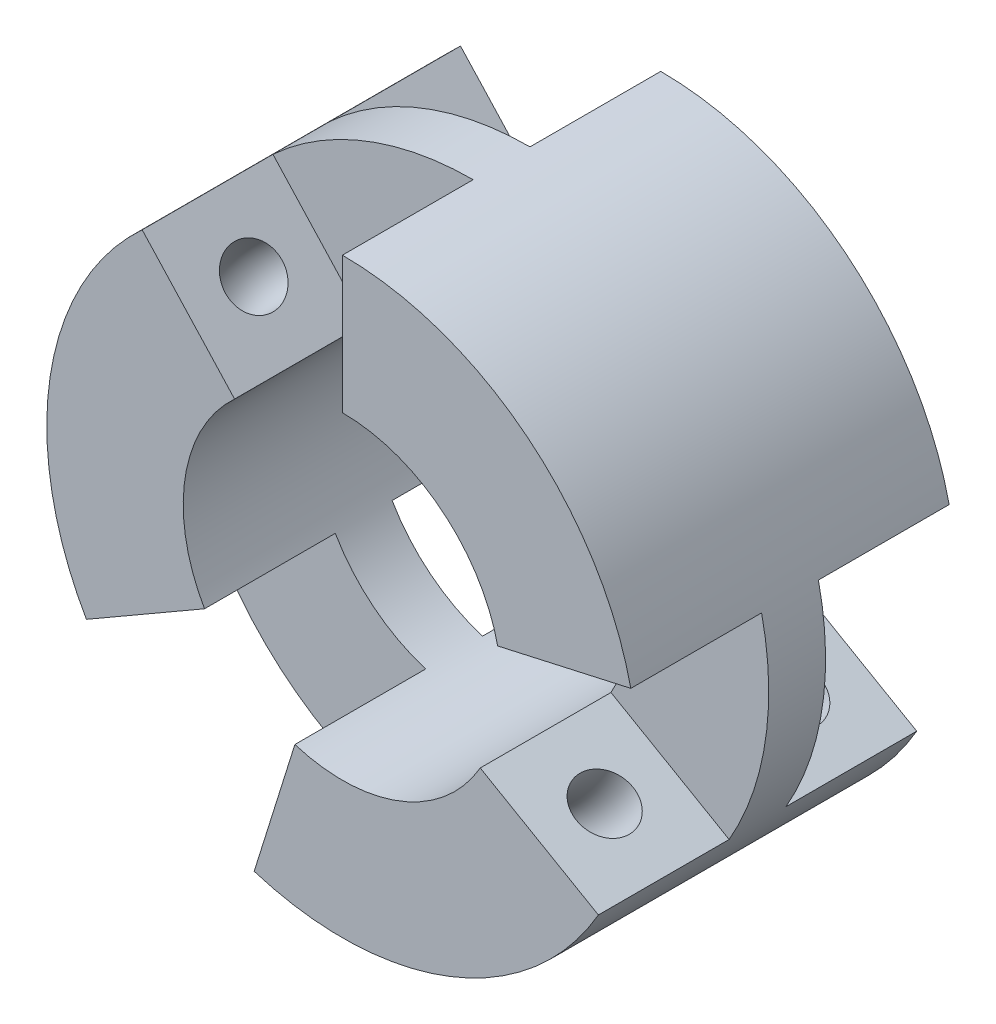
ISO-10303-21;
HEADER;
FILE_DESCRIPTION(('STEP AP214'),'2;1');
FILE_NAME('part.step','',(''),(''),'','','');
FILE_SCHEMA(('AUTOMOTIVE_DESIGN { 1 0 10303 214 1 1 1 1 }'));
ENDSEC;
DATA;
#1=APPLICATION_CONTEXT('core data for automotive mechanical design processes');
#2=APPLICATION_PROTOCOL_DEFINITION('international standard','automotive_design',2000,#1);
#3=PRODUCT_CONTEXT('',#1,'mechanical');
#4=PRODUCT('Part','Part','',(#3));
#5=PRODUCT_RELATED_PRODUCT_CATEGORY('part','',(#4));
#6=PRODUCT_DEFINITION_FORMATION('','',#4);
#7=PRODUCT_DEFINITION_CONTEXT('part definition',#1,'design');
#8=PRODUCT_DEFINITION('design','',#6,#7);
#9=PRODUCT_DEFINITION_SHAPE('','',#8);
#10=(LENGTH_UNIT() NAMED_UNIT(*) SI_UNIT(.MILLI.,.METRE.));
#11=(NAMED_UNIT(*) PLANE_ANGLE_UNIT() SI_UNIT($,.RADIAN.));
#12=(NAMED_UNIT(*) SI_UNIT($,.STERADIAN.) SOLID_ANGLE_UNIT());
#13=UNCERTAINTY_MEASURE_WITH_UNIT(LENGTH_MEASURE(1.E-05),#10,'distance_accuracy_value','');
#14=(GEOMETRIC_REPRESENTATION_CONTEXT(3) GLOBAL_UNCERTAINTY_ASSIGNED_CONTEXT((#13)) GLOBAL_UNIT_ASSIGNED_CONTEXT((#10,
#11,#12)) REPRESENTATION_CONTEXT('',''));
#15=CARTESIAN_POINT('',(0.,0.,0.));
#16=DIRECTION('',(0.,0.,1.));
#17=DIRECTION('',(1.,0.,0.));
#18=AXIS2_PLACEMENT_3D('',#15,#16,#17);
#19=CARTESIAN_POINT('',(0.,0.,0.25));
#20=DIRECTION('',(0.,0.,1.));
#21=DIRECTION('',(1.,0.,0.));
#22=AXIS2_PLACEMENT_3D('',#19,#20,#21);
#23=PLANE('',#22);
#24=DIRECTION('',(-0.677333525702714,0.735676080186879,0.));
#25=VECTOR('',#24,1.);
#26=CARTESIAN_POINT('',(0.,0.,0.25));
#27=LINE('',#26,#25);
#28=CARTESIAN_POINT('',(-0.9482669359838,1.02994651226163,0.25));
#29=VERTEX_POINT('',#28);
#30=CARTESIAN_POINT('',(-1.76106716682706,1.91275780848588,0.25));
#31=VERTEX_POINT('',#30);
#32=EDGE_CURVE('E271',#29,#31,#27,.T.);
#33=ORIENTED_EDGE('',*,*,#32,.F.);
#34=CARTESIAN_POINT('',(0.,0.,0.25));
#35=DIRECTION('',(0.,0.,1.));
#36=DIRECTION('',(1.,0.,0.));
#37=AXIS2_PLACEMENT_3D('',#34,#35,#36);
#38=CIRCLE('',#37,1.4);
#39=CARTESIAN_POINT('',(0.,1.4,0.25));
#40=VERTEX_POINT('',#39);
#41=EDGE_CURVE('E298',#40,#29,#38,.T.);
#42=ORIENTED_EDGE('',*,*,#41,.F.);
#43=DIRECTION('',(0.,1.,0.));
#44=VECTOR('',#43,1.);
#45=CARTESIAN_POINT('',(0.,1.4,0.25));
#46=LINE('',#45,#44);
#47=CARTESIAN_POINT('',(0.,2.6,0.25));
#48=VERTEX_POINT('',#47);
#49=EDGE_CURVE('E332',#40,#48,#46,.T.);
#50=ORIENTED_EDGE('',*,*,#49,.T.);
#51=CARTESIAN_POINT('',(0.,0.,0.25));
#52=DIRECTION('',(0.,0.,1.));
#53=DIRECTION('',(1.,0.,0.));
#54=AXIS2_PLACEMENT_3D('',#51,#52,#53);
#55=CIRCLE('',#54,2.6);
#56=EDGE_CURVE('E303',#48,#31,#55,.T.);
#57=ORIENTED_EDGE('',*,*,#56,.T.);
#58=EDGE_LOOP('',(#33,#42,#50,#57));
#59=FACE_BOUND('',#58,.T.);
#60=ADVANCED_FACE('F33',(#59),#23,.T.);
#61=DIRECTION('',(0.866025403784443,0.499999999999992,0.));
#62=VECTOR('',#61,1.);
#63=CARTESIAN_POINT('',(0.,0.,0.25));
#64=LINE('',#63,#62);
#65=CARTESIAN_POINT('',(-2.25166604983955,-1.29999999999998,0.25));
#66=VERTEX_POINT('',#65);
#67=CARTESIAN_POINT('',(-1.21243556529822,-0.699999999999988,0.25));
#68=VERTEX_POINT('',#67);
#69=EDGE_CURVE('E268',#66,#68,#64,.T.);
#70=ORIENTED_EDGE('',*,*,#69,.F.);
#71=CARTESIAN_POINT('',(-0.775963270022288,-2.48150780848586,0.25));
#72=VERTEX_POINT('',#71);
#73=EDGE_CURVE('E306',#66,#72,#55,.T.);
#74=ORIENTED_EDGE('',*,*,#73,.T.);
#75=DIRECTION('',(-0.298447411547034,-0.954426080186871,0.));
#76=VECTOR('',#75,1.);
#77=CARTESIAN_POINT('',(0.,0.,0.25));
#78=LINE('',#77,#76);
#79=CARTESIAN_POINT('',(-0.417826376165848,-1.33619651226162,0.25));
#80=VERTEX_POINT('',#79);
#81=EDGE_CURVE('E42',#80,#72,#78,.T.);
#82=ORIENTED_EDGE('',*,*,#81,.F.);
#83=EDGE_CURVE('E302',#68,#80,#38,.T.);
#84=ORIENTED_EDGE('',*,*,#83,.F.);
#85=EDGE_LOOP('',(#70,#74,#82,#84));
#86=FACE_BOUND('',#85,.T.);
#87=ADVANCED_FACE('F364',(#86),#23,.T.);
#88=CARTESIAN_POINT('',(0.,0.,1.4));
#89=DIRECTION('',(0.,0.,-1.));
#90=DIRECTION('',(-1.,0.,0.));
#91=AXIS2_PLACEMENT_3D('',#88,#89,#90);
#92=CYLINDRICAL_SURFACE('',#91,1.4);
#93=DIRECTION('',(0.,0.,1.));
#94=VECTOR('',#93,1.);
#95=CARTESIAN_POINT('',(-0.9482669359838,1.02994651226163,-1.4));
#96=LINE('',#95,#94);
#97=CARTESIAN_POINT('',(-0.9482669359838,1.02994651226163,-1.4));
#98=VERTEX_POINT('',#97);
#99=CARTESIAN_POINT('',(-0.9482669359838,1.02994651226163,-0.25));
#100=VERTEX_POINT('',#99);
#101=EDGE_CURVE('E214',#98,#100,#96,.T.);
#102=ORIENTED_EDGE('',*,*,#101,.T.);
#103=CARTESIAN_POINT('',(0.,0.,-0.25));
#104=DIRECTION('',(0.,0.,1.));
#105=DIRECTION('',(1.,0.,0.));
#106=AXIS2_PLACEMENT_3D('',#103,#104,#105);
#107=CIRCLE('',#106,1.4);
#108=CARTESIAN_POINT('',(0.,1.4,-0.25));
#109=VERTEX_POINT('',#108);
#110=EDGE_CURVE('E197',#109,#100,#107,.T.);
#111=ORIENTED_EDGE('',*,*,#110,.F.);
#112=DIRECTION('',(0.,0.,1.));
#113=VECTOR('',#112,1.);
#114=CARTESIAN_POINT('',(0.,1.4,-1.4));
#115=LINE('',#114,#113);
#116=CARTESIAN_POINT('',(0.,1.4,-1.4));
#117=VERTEX_POINT('',#116);
#118=EDGE_CURVE('E210',#117,#109,#115,.T.);
#119=ORIENTED_EDGE('',*,*,#118,.F.);
#120=CARTESIAN_POINT('',(0.,0.,-1.4));
#121=DIRECTION('',(0.,0.,1.));
#122=DIRECTION('',(1.,0.,0.));
#123=AXIS2_PLACEMENT_3D('',#120,#121,#122);
#124=CIRCLE('',#123,1.4);
#125=CARTESIAN_POINT('',(1.36609331214965,0.30625,-1.4));
#126=VERTEX_POINT('',#125);
#127=EDGE_CURVE('E701',#117,#126,#124,.F.);
#128=ORIENTED_EDGE('',*,*,#127,.T.);
#129=DIRECTION('',(0.,0.,1.));
#130=VECTOR('',#129,1.);
#131=CARTESIAN_POINT('',(1.36609331214965,0.30625,-1.4));
#132=LINE('',#131,#130);
#133=CARTESIAN_POINT('',(1.36609331214965,0.30625,-0.25));
#134=VERTEX_POINT('',#133);
#135=EDGE_CURVE('E708',#126,#134,#132,.T.);
#136=ORIENTED_EDGE('',*,*,#135,.T.);
#137=CARTESIAN_POINT('',(1.21243556529821,-0.700000000000006,-0.25));
#138=VERTEX_POINT('',#137);
#139=EDGE_CURVE('E218',#138,#134,#107,.T.);
#140=ORIENTED_EDGE('',*,*,#139,.F.);
#141=DIRECTION('',(0.,0.,1.));
#142=VECTOR('',#141,1.);
#143=CARTESIAN_POINT('',(1.21243556529821,-0.700000000000006,-1.4));
#144=LINE('',#143,#142);
#145=CARTESIAN_POINT('',(1.21243556529821,-0.700000000000006,-1.4));
#146=VERTEX_POINT('',#145);
#147=EDGE_CURVE('E699',#146,#138,#144,.T.);
#148=ORIENTED_EDGE('',*,*,#147,.F.);
#149=CARTESIAN_POINT('',(0.,0.,-1.4));
#150=DIRECTION('',(0.,0.,1.));
#151=DIRECTION('',(1.,0.,0.));
#152=AXIS2_PLACEMENT_3D('',#149,#150,#151);
#153=CIRCLE('',#152,1.4);
#154=CARTESIAN_POINT('',(-0.417826376165848,-1.33619651226162,-1.4));
#155=VERTEX_POINT('',#154);
#156=EDGE_CURVE('E682',#146,#155,#153,.F.);
#157=ORIENTED_EDGE('',*,*,#156,.T.);
#158=DIRECTION('',(0.,0.,1.));
#159=VECTOR('',#158,1.);
#160=CARTESIAN_POINT('',(-0.417826376165848,-1.33619651226162,-1.4));
#161=LINE('',#160,#159);
#162=CARTESIAN_POINT('',(-0.417826376165848,-1.33619651226162,-0.25));
#163=VERTEX_POINT('',#162);
#164=EDGE_CURVE('E691',#155,#163,#161,.T.);
#165=ORIENTED_EDGE('',*,*,#164,.T.);
#166=CARTESIAN_POINT('',(-1.21243556529822,-0.699999999999988,-0.25));
#167=VERTEX_POINT('',#166);
#168=EDGE_CURVE('E216',#167,#163,#107,.T.);
#169=ORIENTED_EDGE('',*,*,#168,.F.);
#170=DIRECTION('',(0.,0.,1.));
#171=VECTOR('',#170,1.);
#172=CARTESIAN_POINT('',(-1.21243556529822,-0.699999999999988,-1.4));
#173=LINE('',#172,#171);
#174=CARTESIAN_POINT('',(-1.21243556529822,-0.699999999999988,-1.4));
#175=VERTEX_POINT('',#174);
#176=EDGE_CURVE('E680',#175,#167,#173,.T.);
#177=ORIENTED_EDGE('',*,*,#176,.F.);
#178=CARTESIAN_POINT('',(0.,0.,-1.4));
#179=DIRECTION('',(0.,0.,1.));
#180=DIRECTION('',(1.,0.,0.));
#181=AXIS2_PLACEMENT_3D('',#178,#179,#180);
#182=CIRCLE('',#181,1.4);
#183=EDGE_CURVE('E204',#175,#98,#182,.F.);
#184=ORIENTED_EDGE('',*,*,#183,.T.);
#185=EDGE_LOOP('',(#102,#111,#119,#128,#136,#140,#148,#157,#165,#169,#177,#184));
#186=FACE_BOUND('',#185,.T.);
#187=ORIENTED_EDGE('',*,*,#41,.T.);
#188=DIRECTION('',(0.,0.,-1.));
#189=VECTOR('',#188,1.);
#190=CARTESIAN_POINT('',(-0.9482669359838,1.02994651226163,1.4));
#191=LINE('',#190,#189);
#192=CARTESIAN_POINT('',(-0.9482669359838,1.02994651226163,1.4));
#193=VERTEX_POINT('',#192);
#194=EDGE_CURVE('E265',#193,#29,#191,.T.);
#195=ORIENTED_EDGE('',*,*,#194,.F.);
#196=CARTESIAN_POINT('',(0.,0.,1.4));
#197=DIRECTION('',(0.,0.,1.));
#198=DIRECTION('',(1.,0.,0.));
#199=AXIS2_PLACEMENT_3D('',#196,#197,#198);
#200=CIRCLE('',#199,1.4);
#201=CARTESIAN_POINT('',(-1.21243556529822,-0.699999999999988,1.4));
#202=VERTEX_POINT('',#201);
#203=EDGE_CURVE('E245',#202,#193,#200,.F.);
#204=ORIENTED_EDGE('',*,*,#203,.F.);
#205=DIRECTION('',(0.,0.,-1.));
#206=VECTOR('',#205,1.);
#207=CARTESIAN_POINT('',(-1.21243556529822,-0.699999999999988,1.4));
#208=LINE('',#207,#206);
#209=EDGE_CURVE('E256',#202,#68,#208,.T.);
#210=ORIENTED_EDGE('',*,*,#209,.T.);
#211=ORIENTED_EDGE('',*,*,#83,.T.);
#212=DIRECTION('',(0.,0.,-1.));
#213=VECTOR('',#212,1.);
#214=CARTESIAN_POINT('',(-0.417826376165848,-1.33619651226162,1.4));
#215=LINE('',#214,#213);
#216=CARTESIAN_POINT('',(-0.417826376165848,-1.33619651226162,1.4));
#217=VERTEX_POINT('',#216);
#218=EDGE_CURVE('E294',#217,#80,#215,.T.);
#219=ORIENTED_EDGE('',*,*,#218,.F.);
#220=CARTESIAN_POINT('',(0.,0.,1.4));
#221=DIRECTION('',(0.,0.,1.));
#222=DIRECTION('',(1.,0.,0.));
#223=AXIS2_PLACEMENT_3D('',#220,#221,#222);
#224=CIRCLE('',#223,1.4);
#225=CARTESIAN_POINT('',(1.21243556529821,-0.700000000000006,1.4));
#226=VERTEX_POINT('',#225);
#227=EDGE_CURVE('E274',#226,#217,#224,.F.);
#228=ORIENTED_EDGE('',*,*,#227,.F.);
#229=DIRECTION('',(0.,0.,-1.));
#230=VECTOR('',#229,1.);
#231=CARTESIAN_POINT('',(1.21243556529821,-0.700000000000006,1.4));
#232=LINE('',#231,#230);
#233=CARTESIAN_POINT('',(1.21243556529821,-0.700000000000006,0.25));
#234=VERTEX_POINT('',#233);
#235=EDGE_CURVE('E285',#226,#234,#232,.T.);
#236=ORIENTED_EDGE('',*,*,#235,.T.);
#237=CARTESIAN_POINT('',(1.36609331214965,0.30625,0.25));
#238=VERTEX_POINT('',#237);
#239=EDGE_CURVE('E297',#234,#238,#38,.T.);
#240=ORIENTED_EDGE('',*,*,#239,.T.);
#241=DIRECTION('',(0.,0.,-1.));
#242=VECTOR('',#241,1.);
#243=CARTESIAN_POINT('',(1.36609331214965,0.30625,1.4));
#244=LINE('',#243,#242);
#245=CARTESIAN_POINT('',(1.36609331214965,0.30625,1.4));
#246=VERTEX_POINT('',#245);
#247=EDGE_CURVE('E329',#246,#238,#244,.T.);
#248=ORIENTED_EDGE('',*,*,#247,.F.);
#249=CARTESIAN_POINT('',(0.,0.,1.4));
#250=DIRECTION('',(0.,0.,1.));
#251=DIRECTION('',(1.,0.,0.));
#252=AXIS2_PLACEMENT_3D('',#249,#250,#251);
#253=CIRCLE('',#252,1.4);
#254=CARTESIAN_POINT('',(0.,1.4,1.4));
#255=VERTEX_POINT('',#254);
#256=EDGE_CURVE('E309',#255,#246,#253,.F.);
#257=ORIENTED_EDGE('',*,*,#256,.F.);
#258=DIRECTION('',(0.,0.,-1.));
#259=VECTOR('',#258,1.);
#260=CARTESIAN_POINT('',(0.,1.4,1.4));
#261=LINE('',#260,#259);
#262=EDGE_CURVE('E320',#255,#40,#261,.T.);
#263=ORIENTED_EDGE('',*,*,#262,.T.);
#264=EDGE_LOOP('',(#187,#195,#204,#210,#211,#219,#228,#236,#240,#248,#257,#263));
#265=FACE_BOUND('',#264,.T.);
#266=ADVANCED_FACE('F35',(#186,#265),#92,.F.);
#267=CARTESIAN_POINT('',(2.53703043684935,0.56875,1.4));
#268=DIRECTION('',(0.21875,-0.97578093724975,0.));
#269=DIRECTION('',(0.97578093724975,0.21875,0.));
#270=AXIS2_PLACEMENT_3D('',#267,#268,#269);
#271=PLANE('',#270);
#272=CARTESIAN_POINT('',(1.9515618744995,0.4375,0.825));
#273=DIRECTION('',(0.21875,-0.97578093724975,0.));
#274=DIRECTION('',(0.97578093724975,0.21875,0.));
#275=AXIS2_PLACEMENT_3D('',#272,#273,#274);
#276=CIRCLE('',#275,0.25);
#277=CARTESIAN_POINT('',(2.19550710881194,0.4921875,0.825));
#278=VERTEX_POINT('',#277);
#279=EDGE_CURVE('E242',#278,#278,#276,.T.);
#280=ORIENTED_EDGE('',*,*,#279,.F.);
#281=EDGE_LOOP('',(#280));
#282=FACE_BOUND('',#281,.T.);
#283=DIRECTION('',(-0.97578093724975,-0.21875,0.));
#284=VECTOR('',#283,1.);
#285=CARTESIAN_POINT('',(2.53703043684935,0.56875,0.25));
#286=LINE('',#285,#284);
#287=CARTESIAN_POINT('',(2.53703043684935,0.56875,0.25));
#288=VERTEX_POINT('',#287);
#289=EDGE_CURVE('E305',#288,#238,#286,.T.);
#290=ORIENTED_EDGE('',*,*,#289,.F.);
#291=DIRECTION('',(0.,0.,-1.));
#292=VECTOR('',#291,1.);
#293=CARTESIAN_POINT('',(2.53703043684935,0.56875,1.4));
#294=LINE('',#293,#292);
#295=CARTESIAN_POINT('',(2.53703043684935,0.56875,1.4));
#296=VERTEX_POINT('',#295);
#297=EDGE_CURVE('E326',#296,#288,#294,.T.);
#298=ORIENTED_EDGE('',*,*,#297,.F.);
#299=DIRECTION('',(-0.97578093724975,-0.21875,0.));
#300=VECTOR('',#299,1.);
#301=CARTESIAN_POINT('',(2.53703043684935,0.56875,1.4));
#302=LINE('',#301,#300);
#303=EDGE_CURVE('E311',#296,#246,#302,.T.);
#304=ORIENTED_EDGE('',*,*,#303,.T.);
#305=ORIENTED_EDGE('',*,*,#247,.T.);
#306=EDGE_LOOP('',(#290,#298,#304,#305));
#307=FACE_BOUND('',#306,.T.);
#308=ADVANCED_FACE('F361',(#282,#307),#271,.T.);
#309=CARTESIAN_POINT('',(0.,0.,1.4));
#310=DIRECTION('',(0.,0.,-1.));
#311=DIRECTION('',(-1.,0.,0.));
#312=AXIS2_PLACEMENT_3D('',#309,#310,#311);
#313=CYLINDRICAL_SURFACE('',#312,2.6);
#314=DIRECTION('',(0.,0.,1.));
#315=VECTOR('',#314,1.);
#316=CARTESIAN_POINT('',(-2.25166604983955,-1.29999999999998,-1.4));
#317=LINE('',#316,#315);
#318=CARTESIAN_POINT('',(-2.25166604983955,-1.29999999999998,-1.4));
#319=VERTEX_POINT('',#318);
#320=CARTESIAN_POINT('',(-2.25166604983955,-1.29999999999998,-0.25));
#321=VERTEX_POINT('',#320);
#322=EDGE_CURVE('E677',#319,#321,#317,.T.);
#323=ORIENTED_EDGE('',*,*,#322,.T.);
#324=CARTESIAN_POINT('',(0.,0.,-0.25));
#325=DIRECTION('',(0.,0.,1.));
#326=DIRECTION('',(1.,0.,0.));
#327=AXIS2_PLACEMENT_3D('',#324,#325,#326);
#328=CIRCLE('',#327,2.6);
#329=CARTESIAN_POINT('',(-0.775963270022288,-2.48150780848586,-0.25));
#330=VERTEX_POINT('',#329);
#331=EDGE_CURVE('E658',#321,#330,#328,.T.);
#332=ORIENTED_EDGE('',*,*,#331,.T.);
#333=DIRECTION('',(0.,0.,1.));
#334=VECTOR('',#333,1.);
#335=CARTESIAN_POINT('',(-0.775963270022288,-2.48150780848586,-1.4));
#336=LINE('',#335,#334);
#337=CARTESIAN_POINT('',(-0.775963270022288,-2.48150780848586,-1.4));
#338=VERTEX_POINT('',#337);
#339=EDGE_CURVE('E694',#338,#330,#336,.T.);
#340=ORIENTED_EDGE('',*,*,#339,.F.);
#341=CARTESIAN_POINT('',(0.,0.,-1.4));
#342=DIRECTION('',(0.,0.,1.));
#343=DIRECTION('',(1.,0.,0.));
#344=AXIS2_PLACEMENT_3D('',#341,#342,#343);
#345=CIRCLE('',#344,2.6);
#346=CARTESIAN_POINT('',(2.25166604983953,-1.30000000000001,-1.4));
#347=VERTEX_POINT('',#346);
#348=EDGE_CURVE('E687',#347,#338,#345,.F.);
#349=ORIENTED_EDGE('',*,*,#348,.F.);
#350=DIRECTION('',(0.,0.,1.));
#351=VECTOR('',#350,1.);
#352=CARTESIAN_POINT('',(2.25166604983953,-1.30000000000001,-1.4));
#353=LINE('',#352,#351);
#354=CARTESIAN_POINT('',(2.25166604983953,-1.30000000000001,-0.25));
#355=VERTEX_POINT('',#354);
#356=EDGE_CURVE('E696',#347,#355,#353,.T.);
#357=ORIENTED_EDGE('',*,*,#356,.T.);
#358=CARTESIAN_POINT('',(2.53703043684935,0.56875,-0.25));
#359=VERTEX_POINT('',#358);
#360=EDGE_CURVE('E215',#355,#359,#328,.T.);
#361=ORIENTED_EDGE('',*,*,#360,.T.);
#362=DIRECTION('',(0.,0.,1.));
#363=VECTOR('',#362,1.);
#364=CARTESIAN_POINT('',(2.53703043684935,0.56875,-1.4));
#365=LINE('',#364,#363);
#366=CARTESIAN_POINT('',(2.53703043684935,0.56875,-1.4));
#367=VERTEX_POINT('',#366);
#368=EDGE_CURVE('E49',#367,#359,#365,.T.);
#369=ORIENTED_EDGE('',*,*,#368,.F.);
#370=CARTESIAN_POINT('',(0.,0.,-1.4));
#371=DIRECTION('',(0.,0.,1.));
#372=DIRECTION('',(1.,0.,0.));
#373=AXIS2_PLACEMENT_3D('',#370,#371,#372);
#374=CIRCLE('',#373,2.6);
#375=CARTESIAN_POINT('',(0.,2.6,-1.4));
#376=VERTEX_POINT('',#375);
#377=EDGE_CURVE('E704',#376,#367,#374,.F.);
#378=ORIENTED_EDGE('',*,*,#377,.F.);
#379=DIRECTION('',(0.,0.,1.));
#380=VECTOR('',#379,1.);
#381=CARTESIAN_POINT('',(0.,2.6,-1.4));
#382=LINE('',#381,#380);
#383=CARTESIAN_POINT('',(0.,2.6,-0.25));
#384=VERTEX_POINT('',#383);
#385=EDGE_CURVE('E223',#376,#384,#382,.T.);
#386=ORIENTED_EDGE('',*,*,#385,.T.);
#387=CARTESIAN_POINT('',(-1.76106716682706,1.91275780848588,-0.25));
#388=VERTEX_POINT('',#387);
#389=EDGE_CURVE('E199',#384,#388,#328,.T.);
#390=ORIENTED_EDGE('',*,*,#389,.T.);
#391=DIRECTION('',(0.,0.,1.));
#392=VECTOR('',#391,1.);
#393=CARTESIAN_POINT('',(-1.76106716682706,1.91275780848588,-1.4));
#394=LINE('',#393,#392);
#395=CARTESIAN_POINT('',(-1.76106716682706,1.91275780848588,-1.4));
#396=VERTEX_POINT('',#395);
#397=EDGE_CURVE('E674',#396,#388,#394,.T.);
#398=ORIENTED_EDGE('',*,*,#397,.F.);
#399=CARTESIAN_POINT('',(0.,0.,-1.4));
#400=DIRECTION('',(0.,0.,1.));
#401=DIRECTION('',(1.,0.,0.));
#402=AXIS2_PLACEMENT_3D('',#399,#400,#401);
#403=CIRCLE('',#402,2.6);
#404=EDGE_CURVE('E669',#319,#396,#403,.F.);
#405=ORIENTED_EDGE('',*,*,#404,.F.);
#406=EDGE_LOOP('',(#323,#332,#340,#349,#357,#361,#369,#378,#386,#390,#398,#405));
#407=FACE_BOUND('',#406,.T.);
#408=ORIENTED_EDGE('',*,*,#73,.F.);
#409=DIRECTION('',(0.,0.,-1.));
#410=VECTOR('',#409,1.);
#411=CARTESIAN_POINT('',(-2.25166604983955,-1.29999999999998,1.4));
#412=LINE('',#411,#410);
#413=CARTESIAN_POINT('',(-2.25166604983955,-1.29999999999998,1.4));
#414=VERTEX_POINT('',#413);
#415=EDGE_CURVE('E259',#414,#66,#412,.T.);
#416=ORIENTED_EDGE('',*,*,#415,.F.);
#417=CARTESIAN_POINT('',(0.,0.,1.4));
#418=DIRECTION('',(0.,0.,1.));
#419=DIRECTION('',(1.,0.,0.));
#420=AXIS2_PLACEMENT_3D('',#417,#418,#419);
#421=CIRCLE('',#420,2.6);
#422=CARTESIAN_POINT('',(-1.76106716682706,1.91275780848588,1.4));
#423=VERTEX_POINT('',#422);
#424=EDGE_CURVE('E250',#414,#423,#421,.F.);
#425=ORIENTED_EDGE('',*,*,#424,.T.);
#426=DIRECTION('',(0.,0.,-1.));
#427=VECTOR('',#426,1.);
#428=CARTESIAN_POINT('',(-1.76106716682706,1.91275780848588,1.4));
#429=LINE('',#428,#427);
#430=EDGE_CURVE('E262',#423,#31,#429,.T.);
#431=ORIENTED_EDGE('',*,*,#430,.T.);
#432=ORIENTED_EDGE('',*,*,#56,.F.);
#433=DIRECTION('',(0.,0.,-1.));
#434=VECTOR('',#433,1.);
#435=CARTESIAN_POINT('',(0.,2.6,1.4));
#436=LINE('',#435,#434);
#437=CARTESIAN_POINT('',(0.,2.6,1.4));
#438=VERTEX_POINT('',#437);
#439=EDGE_CURVE('E323',#438,#48,#436,.T.);
#440=ORIENTED_EDGE('',*,*,#439,.F.);
#441=CARTESIAN_POINT('',(0.,0.,1.4));
#442=DIRECTION('',(0.,0.,1.));
#443=DIRECTION('',(1.,0.,0.));
#444=AXIS2_PLACEMENT_3D('',#441,#442,#443);
#445=CIRCLE('',#444,2.6);
#446=EDGE_CURVE('E314',#438,#296,#445,.F.);
#447=ORIENTED_EDGE('',*,*,#446,.T.);
#448=ORIENTED_EDGE('',*,*,#297,.T.);
#449=CARTESIAN_POINT('',(2.25166604983953,-1.30000000000001,0.25));
#450=VERTEX_POINT('',#449);
#451=EDGE_CURVE('E301',#450,#288,#55,.T.);
#452=ORIENTED_EDGE('',*,*,#451,.F.);
#453=DIRECTION('',(0.,0.,-1.));
#454=VECTOR('',#453,1.);
#455=CARTESIAN_POINT('',(2.25166604983953,-1.30000000000001,1.4));
#456=LINE('',#455,#454);
#457=CARTESIAN_POINT('',(2.25166604983953,-1.30000000000001,1.4));
#458=VERTEX_POINT('',#457);
#459=EDGE_CURVE('E288',#458,#450,#456,.T.);
#460=ORIENTED_EDGE('',*,*,#459,.F.);
#461=CARTESIAN_POINT('',(0.,0.,1.4));
#462=DIRECTION('',(0.,0.,1.));
#463=DIRECTION('',(1.,0.,0.));
#464=AXIS2_PLACEMENT_3D('',#461,#462,#463);
#465=CIRCLE('',#464,2.6);
#466=CARTESIAN_POINT('',(-0.775963270022288,-2.48150780848586,1.4));
#467=VERTEX_POINT('',#466);
#468=EDGE_CURVE('E279',#458,#467,#465,.F.);
#469=ORIENTED_EDGE('',*,*,#468,.T.);
#470=DIRECTION('',(0.,0.,-1.));
#471=VECTOR('',#470,1.);
#472=CARTESIAN_POINT('',(-0.775963270022288,-2.48150780848586,1.4));
#473=LINE('',#472,#471);
#474=EDGE_CURVE('E291',#467,#72,#473,.T.);
#475=ORIENTED_EDGE('',*,*,#474,.T.);
#476=EDGE_LOOP('',(#408,#416,#425,#431,#432,#440,#447,#448,#452,#460,#469,#475));
#477=FACE_BOUND('',#476,.T.);
#478=ADVANCED_FACE('F346',(#407,#477),#313,.T.);
#479=CARTESIAN_POINT('',(0.,1.4,1.4));
#480=DIRECTION('',(-1.,0.,0.));
#481=DIRECTION('',(0.,-1.,0.));
#482=AXIS2_PLACEMENT_3D('',#479,#480,#481);
#483=PLANE('',#482);
#484=CARTESIAN_POINT('',(0.,2.,0.825));
#485=DIRECTION('',(-1.,0.,0.));
#486=DIRECTION('',(0.,-1.,0.));
#487=AXIS2_PLACEMENT_3D('',#484,#485,#486);
#488=CIRCLE('',#487,0.25);
#489=CARTESIAN_POINT('',(0.,2.25,0.825));
#490=VERTEX_POINT('',#489);
#491=EDGE_CURVE('E239',#490,#490,#488,.T.);
#492=ORIENTED_EDGE('',*,*,#491,.F.);
#493=EDGE_LOOP('',(#492));
#494=FACE_BOUND('',#493,.T.);
#495=ORIENTED_EDGE('',*,*,#49,.F.);
#496=ORIENTED_EDGE('',*,*,#262,.F.);
#497=DIRECTION('',(0.,1.,0.));
#498=VECTOR('',#497,1.);
#499=CARTESIAN_POINT('',(0.,1.4,1.4));
#500=LINE('',#499,#498);
#501=EDGE_CURVE('E317',#255,#438,#500,.T.);
#502=ORIENTED_EDGE('',*,*,#501,.T.);
#503=ORIENTED_EDGE('',*,*,#439,.T.);
#504=EDGE_LOOP('',(#495,#496,#502,#503));
#505=FACE_BOUND('',#504,.T.);
#506=ADVANCED_FACE('F380',(#494,#505),#483,.T.);
#507=CARTESIAN_POINT('',(0.,0.,1.4));
#508=DIRECTION('',(0.,0.,1.));
#509=DIRECTION('',(1.,0.,0.));
#510=AXIS2_PLACEMENT_3D('',#507,#508,#509);
#511=PLANE('',#510);
#512=ORIENTED_EDGE('',*,*,#256,.T.);
#513=ORIENTED_EDGE('',*,*,#303,.F.);
#514=ORIENTED_EDGE('',*,*,#446,.F.);
#515=ORIENTED_EDGE('',*,*,#501,.F.);
#516=EDGE_LOOP('',(#512,#513,#514,#515));
#517=FACE_BOUND('',#516,.T.);
#518=ADVANCED_FACE('F383',(#517),#511,.T.);
#519=DIRECTION('',(-0.866025403784436,0.500000000000004,0.));
#520=VECTOR('',#519,1.);
#521=CARTESIAN_POINT('',(0.,0.,0.25));
#522=LINE('',#521,#520);
#523=EDGE_CURVE('E334',#450,#234,#522,.T.);
#524=ORIENTED_EDGE('',*,*,#523,.F.);
#525=ORIENTED_EDGE('',*,*,#451,.T.);
#526=ORIENTED_EDGE('',*,*,#289,.T.);
#527=ORIENTED_EDGE('',*,*,#239,.F.);
#528=EDGE_LOOP('',(#524,#525,#526,#527));
#529=FACE_BOUND('',#528,.T.);
#530=ADVANCED_FACE('F363',(#529),#23,.T.);
#531=CARTESIAN_POINT('',(-0.775963270022288,-2.48150780848586,1.4));
#532=DIRECTION('',(-0.954426080186871,0.298447411547034,0.));
#533=DIRECTION('',(-0.298447411547034,-0.954426080186871,0.));
#534=AXIS2_PLACEMENT_3D('',#531,#532,#533);
#535=PLANE('',#534);
#536=CARTESIAN_POINT('',(-0.596894823094068,-1.90885216037374,0.825));
#537=DIRECTION('',(-0.954426080186871,0.298447411547034,0.));
#538=DIRECTION('',(-0.298447411547034,-0.954426080186871,0.));
#539=AXIS2_PLACEMENT_3D('',#536,#537,#538);
#540=CIRCLE('',#539,0.25);
#541=CARTESIAN_POINT('',(-0.671506675980827,-2.14745868042046,0.825));
#542=VERTEX_POINT('',#541);
#543=EDGE_CURVE('E236',#542,#542,#540,.T.);
#544=ORIENTED_EDGE('',*,*,#543,.F.);
#545=EDGE_LOOP('',(#544));
#546=FACE_BOUND('',#545,.T.);
#547=ORIENTED_EDGE('',*,*,#218,.T.);
#548=ORIENTED_EDGE('',*,*,#81,.T.);
#549=ORIENTED_EDGE('',*,*,#474,.F.);
#550=DIRECTION('',(0.298447411547034,0.954426080186871,0.));
#551=VECTOR('',#550,1.);
#552=CARTESIAN_POINT('',(-0.775963270022288,-2.48150780848586,1.4));
#553=LINE('',#552,#551);
#554=EDGE_CURVE('E276',#467,#217,#553,.T.);
#555=ORIENTED_EDGE('',*,*,#554,.T.);
#556=EDGE_LOOP('',(#547,#548,#549,#555));
#557=FACE_BOUND('',#556,.T.);
#558=ADVANCED_FACE('F340',(#546,#557),#535,.T.);
#559=CARTESIAN_POINT('',(1.21243556529821,-0.700000000000006,1.4));
#560=DIRECTION('',(0.500000000000004,0.866025403784436,0.));
#561=DIRECTION('',(-0.866025403784436,0.500000000000004,0.));
#562=AXIS2_PLACEMENT_3D('',#559,#560,#561);
#563=PLANE('',#562);
#564=CARTESIAN_POINT('',(1.73205080756887,-1.00000000000001,0.825));
#565=DIRECTION('',(0.500000000000004,0.866025403784436,0.));
#566=DIRECTION('',(-0.866025403784436,0.500000000000004,0.));
#567=AXIS2_PLACEMENT_3D('',#564,#565,#566);
#568=CIRCLE('',#567,0.25);
#569=CARTESIAN_POINT('',(1.94855715851498,-1.12500000000001,0.825));
#570=VERTEX_POINT('',#569);
#571=EDGE_CURVE('E233',#570,#570,#568,.T.);
#572=ORIENTED_EDGE('',*,*,#571,.F.);
#573=EDGE_LOOP('',(#572));
#574=FACE_BOUND('',#573,.T.);
#575=ORIENTED_EDGE('',*,*,#459,.T.);
#576=ORIENTED_EDGE('',*,*,#523,.T.);
#577=ORIENTED_EDGE('',*,*,#235,.F.);
#578=DIRECTION('',(0.866025403784436,-0.500000000000004,0.));
#579=VECTOR('',#578,1.);
#580=CARTESIAN_POINT('',(1.21243556529821,-0.700000000000006,1.4));
#581=LINE('',#580,#579);
#582=EDGE_CURVE('E282',#226,#458,#581,.T.);
#583=ORIENTED_EDGE('',*,*,#582,.T.);
#584=EDGE_LOOP('',(#575,#576,#577,#583));
#585=FACE_BOUND('',#584,.T.);
#586=ADVANCED_FACE('F353',(#574,#585),#563,.T.);
#587=CARTESIAN_POINT('',(0.,0.,1.4));
#588=DIRECTION('',(0.,0.,1.));
#589=DIRECTION('',(1.,0.,0.));
#590=AXIS2_PLACEMENT_3D('',#587,#588,#589);
#591=PLANE('',#590);
#592=ORIENTED_EDGE('',*,*,#227,.T.);
#593=ORIENTED_EDGE('',*,*,#554,.F.);
#594=ORIENTED_EDGE('',*,*,#468,.F.);
#595=ORIENTED_EDGE('',*,*,#582,.F.);
#596=EDGE_LOOP('',(#592,#593,#594,#595));
#597=FACE_BOUND('',#596,.T.);
#598=ADVANCED_FACE('F351',(#597),#591,.T.);
#599=CARTESIAN_POINT('',(-1.76106716682706,1.91275780848588,1.4));
#600=DIRECTION('',(0.735676080186879,0.677333525702714,0.));
#601=DIRECTION('',(-0.677333525702714,0.735676080186879,0.));
#602=AXIS2_PLACEMENT_3D('',#599,#600,#601);
#603=PLANE('',#602);
#604=CARTESIAN_POINT('',(-1.35466705140543,1.47135216037376,0.825));
#605=DIRECTION('',(0.735676080186879,0.677333525702714,0.));
#606=DIRECTION('',(-0.677333525702714,0.735676080186879,0.));
#607=AXIS2_PLACEMENT_3D('',#604,#605,#606);
#608=CIRCLE('',#607,0.25);
#609=CARTESIAN_POINT('',(-1.52400043283111,1.65527118042048,0.825));
#610=VERTEX_POINT('',#609);
#611=EDGE_CURVE('E226',#610,#610,#608,.T.);
#612=ORIENTED_EDGE('',*,*,#611,.F.);
#613=EDGE_LOOP('',(#612));
#614=FACE_BOUND('',#613,.T.);
#615=ORIENTED_EDGE('',*,*,#194,.T.);
#616=ORIENTED_EDGE('',*,*,#32,.T.);
#617=ORIENTED_EDGE('',*,*,#430,.F.);
#618=DIRECTION('',(0.677333525702714,-0.735676080186879,0.));
#619=VECTOR('',#618,1.);
#620=CARTESIAN_POINT('',(-1.76106716682706,1.91275780848588,1.4));
#621=LINE('',#620,#619);
#622=EDGE_CURVE('E247',#423,#193,#621,.T.);
#623=ORIENTED_EDGE('',*,*,#622,.T.);
#624=EDGE_LOOP('',(#615,#616,#617,#623));
#625=FACE_BOUND('',#624,.T.);
#626=ADVANCED_FACE('F374',(#614,#625),#603,.T.);
#627=CARTESIAN_POINT('',(-1.21243556529822,-0.699999999999988,1.4));
#628=DIRECTION('',(0.499999999999992,-0.866025403784443,0.));
#629=DIRECTION('',(0.866025403784443,0.499999999999992,0.));
#630=AXIS2_PLACEMENT_3D('',#627,#628,#629);
#631=PLANE('',#630);
#632=CARTESIAN_POINT('',(-1.73205080756889,-0.999999999999984,0.825));
#633=DIRECTION('',(0.499999999999992,-0.866025403784443,0.));
#634=DIRECTION('',(0.866025403784443,0.499999999999992,0.));
#635=AXIS2_PLACEMENT_3D('',#632,#633,#634);
#636=CIRCLE('',#635,0.25);
#637=CARTESIAN_POINT('',(-1.948557158515,-1.12499999999998,0.825));
#638=VERTEX_POINT('',#637);
#639=EDGE_CURVE('E222',#638,#638,#636,.T.);
#640=ORIENTED_EDGE('',*,*,#639,.F.);
#641=EDGE_LOOP('',(#640));
#642=FACE_BOUND('',#641,.T.);
#643=ORIENTED_EDGE('',*,*,#415,.T.);
#644=ORIENTED_EDGE('',*,*,#69,.T.);
#645=ORIENTED_EDGE('',*,*,#209,.F.);
#646=DIRECTION('',(-0.866025403784443,-0.499999999999992,0.));
#647=VECTOR('',#646,1.);
#648=CARTESIAN_POINT('',(-1.21243556529822,-0.699999999999988,1.4));
#649=LINE('',#648,#647);
#650=EDGE_CURVE('E253',#202,#414,#649,.T.);
#651=ORIENTED_EDGE('',*,*,#650,.T.);
#652=EDGE_LOOP('',(#643,#644,#645,#651));
#653=FACE_BOUND('',#652,.T.);
#654=ADVANCED_FACE('F366',(#642,#653),#631,.T.);
#655=CARTESIAN_POINT('',(0.,0.,1.4));
#656=DIRECTION('',(0.,0.,1.));
#657=DIRECTION('',(1.,0.,0.));
#658=AXIS2_PLACEMENT_3D('',#655,#656,#657);
#659=PLANE('',#658);
#660=ORIENTED_EDGE('',*,*,#203,.T.);
#661=ORIENTED_EDGE('',*,*,#622,.F.);
#662=ORIENTED_EDGE('',*,*,#424,.F.);
#663=ORIENTED_EDGE('',*,*,#650,.F.);
#664=EDGE_LOOP('',(#660,#661,#662,#663));
#665=FACE_BOUND('',#664,.T.);
#666=ADVANCED_FACE('F371',(#665),#659,.T.);
#667=CARTESIAN_POINT('',(0.,0.,0.825));
#668=DIRECTION('',(0.,0.,-1.));
#669=DIRECTION('',(-1.,0.,0.));
#670=AXIS2_PLACEMENT_3D('',#667,#668,#669);
#671=TOROIDAL_SURFACE('',#670,2.,0.25);
#672=CARTESIAN_POINT('',(0.,0.,0.825));
#673=DIRECTION('',(0.,0.,-1.));
#674=DIRECTION('',(-1.,0.,0.));
#675=AXIS2_PLACEMENT_3D('',#672,#673,#674);
#676=CIRCLE('',#675,2.25);
#677=EDGE_CURVE('',#638,#610,#676,.T.);
#678=ORIENTED_EDGE('',*,*,#639,.T.);
#679=ORIENTED_EDGE('',*,*,#611,.T.);
#680=ORIENTED_EDGE('',*,*,#677,.T.);
#681=ORIENTED_EDGE('',*,*,#677,.F.);
#682=EDGE_LOOP('',(#678,#680,#679,#681));
#683=FACE_BOUND('',#682,.T.);
#684=ADVANCED_FACE('F417',(#683),#671,.F.);
#685=CARTESIAN_POINT('',(0.,0.,0.825));
#686=DIRECTION('',(0.,0.,-1.));
#687=DIRECTION('',(-1.,0.,0.));
#688=AXIS2_PLACEMENT_3D('',#685,#686,#687);
#689=CIRCLE('',#688,2.25);
#690=EDGE_CURVE('',#570,#542,#689,.T.);
#691=ORIENTED_EDGE('',*,*,#571,.T.);
#692=ORIENTED_EDGE('',*,*,#543,.T.);
#693=ORIENTED_EDGE('',*,*,#690,.T.);
#694=ORIENTED_EDGE('',*,*,#690,.F.);
#695=EDGE_LOOP('',(#691,#693,#692,#694));
#696=FACE_BOUND('',#695,.T.);
#697=ADVANCED_FACE('F415',(#696),#671,.F.);
#698=CARTESIAN_POINT('',(0.,0.,0.825));
#699=DIRECTION('',(0.,0.,-1.));
#700=DIRECTION('',(-1.,0.,0.));
#701=AXIS2_PLACEMENT_3D('',#698,#699,#700);
#702=CIRCLE('',#701,2.25);
#703=EDGE_CURVE('',#490,#278,#702,.T.);
#704=ORIENTED_EDGE('',*,*,#491,.T.);
#705=ORIENTED_EDGE('',*,*,#279,.T.);
#706=ORIENTED_EDGE('',*,*,#703,.T.);
#707=ORIENTED_EDGE('',*,*,#703,.F.);
#708=EDGE_LOOP('',(#704,#706,#705,#707));
#709=FACE_BOUND('',#708,.T.);
#710=ADVANCED_FACE('F412',(#709),#671,.F.);
#711=CARTESIAN_POINT('',(0.,1.4,-1.4));
#712=DIRECTION('',(1.,0.,0.));
#713=DIRECTION('',(0.,1.,0.));
#714=AXIS2_PLACEMENT_3D('',#711,#712,#713);
#715=PLANE('',#714);
#716=CARTESIAN_POINT('',(0.,2.,-0.825));
#717=DIRECTION('',(1.,0.,0.));
#718=DIRECTION('',(0.,1.,0.));
#719=AXIS2_PLACEMENT_3D('',#716,#717,#718);
#720=CIRCLE('',#719,0.25);
#721=CARTESIAN_POINT('',(0.,2.25,-0.825));
#722=VERTEX_POINT('',#721);
#723=EDGE_CURVE('E649',#722,#722,#720,.T.);
#724=ORIENTED_EDGE('',*,*,#723,.T.);
#725=EDGE_LOOP('',(#724));
#726=FACE_BOUND('',#725,.T.);
#727=ORIENTED_EDGE('',*,*,#118,.T.);
#728=DIRECTION('',(0.,1.,0.));
#729=VECTOR('',#728,1.);
#730=CARTESIAN_POINT('',(0.,1.4,-0.25));
#731=LINE('',#730,#729);
#732=EDGE_CURVE('E194',#109,#384,#731,.T.);
#733=ORIENTED_EDGE('',*,*,#732,.T.);
#734=ORIENTED_EDGE('',*,*,#385,.F.);
#735=DIRECTION('',(0.,1.,0.));
#736=VECTOR('',#735,1.);
#737=CARTESIAN_POINT('',(0.,1.4,-1.4));
#738=LINE('',#737,#736);
#739=EDGE_CURVE('E220',#117,#376,#738,.T.);
#740=ORIENTED_EDGE('',*,*,#739,.F.);
#741=EDGE_LOOP('',(#727,#733,#734,#740));
#742=FACE_BOUND('',#741,.T.);
#743=ADVANCED_FACE('F219',(#726,#742),#715,.F.);
#744=CARTESIAN_POINT('',(2.53703043684935,0.56875,-1.4));
#745=DIRECTION('',(-0.21875,0.97578093724975,0.));
#746=DIRECTION('',(-0.97578093724975,-0.21875,0.));
#747=AXIS2_PLACEMENT_3D('',#744,#745,#746);
#748=PLANE('',#747);
#749=CARTESIAN_POINT('',(1.9515618744995,0.4375,-0.825));
#750=DIRECTION('',(-0.21875,0.97578093724975,0.));
#751=DIRECTION('',(-0.97578093724975,-0.21875,0.));
#752=AXIS2_PLACEMENT_3D('',#749,#750,#751);
#753=CIRCLE('',#752,0.25);
#754=CARTESIAN_POINT('',(2.19550710881194,0.4921875,-0.825));
#755=VERTEX_POINT('',#754);
#756=EDGE_CURVE('E646',#755,#755,#753,.T.);
#757=ORIENTED_EDGE('',*,*,#756,.T.);
#758=EDGE_LOOP('',(#757));
#759=FACE_BOUND('',#758,.T.);
#760=ORIENTED_EDGE('',*,*,#368,.T.);
#761=DIRECTION('',(-0.97578093724975,-0.21875,0.));
#762=VECTOR('',#761,1.);
#763=CARTESIAN_POINT('',(2.53703043684935,0.56875,-0.25));
#764=LINE('',#763,#762);
#765=EDGE_CURVE('E53',#359,#134,#764,.T.);
#766=ORIENTED_EDGE('',*,*,#765,.T.);
#767=ORIENTED_EDGE('',*,*,#135,.F.);
#768=DIRECTION('',(-0.97578093724975,-0.21875,0.));
#769=VECTOR('',#768,1.);
#770=CARTESIAN_POINT('',(2.53703043684935,0.56875,-1.4));
#771=LINE('',#770,#769);
#772=EDGE_CURVE('E706',#367,#126,#771,.T.);
#773=ORIENTED_EDGE('',*,*,#772,.F.);
#774=EDGE_LOOP('',(#760,#766,#767,#773));
#775=FACE_BOUND('',#774,.T.);
#776=ADVANCED_FACE('F423',(#759,#775),#748,.F.);
#777=CARTESIAN_POINT('',(0.,0.,-1.4));
#778=DIRECTION('',(0.,0.,-1.));
#779=DIRECTION('',(1.,0.,0.));
#780=AXIS2_PLACEMENT_3D('',#777,#778,#779);
#781=PLANE('',#780);
#782=ORIENTED_EDGE('',*,*,#127,.F.);
#783=ORIENTED_EDGE('',*,*,#739,.T.);
#784=ORIENTED_EDGE('',*,*,#377,.T.);
#785=ORIENTED_EDGE('',*,*,#772,.T.);
#786=EDGE_LOOP('',(#782,#783,#784,#785));
#787=FACE_BOUND('',#786,.T.);
#788=ADVANCED_FACE('F517',(#787),#781,.T.);
#789=CARTESIAN_POINT('',(1.21243556529821,-0.700000000000006,-1.4));
#790=DIRECTION('',(-0.500000000000004,-0.866025403784436,0.));
#791=DIRECTION('',(0.866025403784436,-0.500000000000004,0.));
#792=AXIS2_PLACEMENT_3D('',#789,#790,#791);
#793=PLANE('',#792);
#794=CARTESIAN_POINT('',(1.73205080756887,-1.00000000000001,-0.825));
#795=DIRECTION('',(-0.500000000000004,-0.866025403784436,0.));
#796=DIRECTION('',(0.866025403784436,-0.500000000000004,0.));
#797=AXIS2_PLACEMENT_3D('',#794,#795,#796);
#798=CIRCLE('',#797,0.25);
#799=CARTESIAN_POINT('',(1.94855715851498,-1.12500000000001,-0.825));
#800=VERTEX_POINT('',#799);
#801=EDGE_CURVE('E652',#800,#800,#798,.T.);
#802=ORIENTED_EDGE('',*,*,#801,.T.);
#803=EDGE_LOOP('',(#802));
#804=FACE_BOUND('',#803,.T.);
#805=ORIENTED_EDGE('',*,*,#147,.T.);
#806=DIRECTION('',(0.866025403784436,-0.500000000000004,0.));
#807=VECTOR('',#806,1.);
#808=CARTESIAN_POINT('',(1.21243556529821,-0.700000000000006,-0.25));
#809=LINE('',#808,#807);
#810=EDGE_CURVE('E663',#138,#355,#809,.T.);
#811=ORIENTED_EDGE('',*,*,#810,.T.);
#812=ORIENTED_EDGE('',*,*,#356,.F.);
#813=DIRECTION('',(0.866025403784436,-0.500000000000004,0.));
#814=VECTOR('',#813,1.);
#815=CARTESIAN_POINT('',(1.21243556529821,-0.700000000000006,-1.4));
#816=LINE('',#815,#814);
#817=EDGE_CURVE('E685',#146,#347,#816,.T.);
#818=ORIENTED_EDGE('',*,*,#817,.F.);
#819=EDGE_LOOP('',(#805,#811,#812,#818));
#820=FACE_BOUND('',#819,.T.);
#821=ADVANCED_FACE('F527',(#804,#820),#793,.F.);
#822=CARTESIAN_POINT('',(-0.775963270022288,-2.48150780848586,-1.4));
#823=DIRECTION('',(0.954426080186871,-0.298447411547034,0.));
#824=DIRECTION('',(0.298447411547034,0.954426080186871,0.));
#825=AXIS2_PLACEMENT_3D('',#822,#823,#824);
#826=PLANE('',#825);
#827=CARTESIAN_POINT('',(-0.596894823094068,-1.90885216037374,-0.825));
#828=DIRECTION('',(0.954426080186871,-0.298447411547034,0.));
#829=DIRECTION('',(0.298447411547034,0.954426080186871,0.));
#830=AXIS2_PLACEMENT_3D('',#827,#828,#829);
#831=CIRCLE('',#830,0.25);
#832=CARTESIAN_POINT('',(-0.671506675980827,-2.14745868042046,-0.825));
#833=VERTEX_POINT('',#832);
#834=EDGE_CURVE('E738',#833,#833,#831,.T.);
#835=ORIENTED_EDGE('',*,*,#834,.T.);
#836=EDGE_LOOP('',(#835));
#837=FACE_BOUND('',#836,.T.);
#838=ORIENTED_EDGE('',*,*,#339,.T.);
#839=DIRECTION('',(0.298447411547034,0.954426080186871,0.));
#840=VECTOR('',#839,1.);
#841=CARTESIAN_POINT('',(-0.775963270022288,-2.48150780848586,-0.25));
#842=LINE('',#841,#840);
#843=EDGE_CURVE('E661',#330,#163,#842,.T.);
#844=ORIENTED_EDGE('',*,*,#843,.T.);
#845=ORIENTED_EDGE('',*,*,#164,.F.);
#846=DIRECTION('',(0.298447411547034,0.954426080186871,0.));
#847=VECTOR('',#846,1.);
#848=CARTESIAN_POINT('',(-0.775963270022288,-2.48150780848586,-1.4));
#849=LINE('',#848,#847);
#850=EDGE_CURVE('E689',#338,#155,#849,.T.);
#851=ORIENTED_EDGE('',*,*,#850,.F.);
#852=EDGE_LOOP('',(#838,#844,#845,#851));
#853=FACE_BOUND('',#852,.T.);
#854=ADVANCED_FACE('F537',(#837,#853),#826,.F.);
#855=CARTESIAN_POINT('',(0.,0.,-1.4));
#856=DIRECTION('',(0.,0.,-1.));
#857=DIRECTION('',(1.,0.,0.));
#858=AXIS2_PLACEMENT_3D('',#855,#856,#857);
#859=PLANE('',#858);
#860=ORIENTED_EDGE('',*,*,#156,.F.);
#861=ORIENTED_EDGE('',*,*,#817,.T.);
#862=ORIENTED_EDGE('',*,*,#348,.T.);
#863=ORIENTED_EDGE('',*,*,#850,.T.);
#864=EDGE_LOOP('',(#860,#861,#862,#863));
#865=FACE_BOUND('',#864,.T.);
#866=ADVANCED_FACE('F547',(#865),#859,.T.);
#867=CARTESIAN_POINT('',(-1.21243556529822,-0.699999999999988,-1.4));
#868=DIRECTION('',(-0.499999999999992,0.866025403784443,0.));
#869=DIRECTION('',(-0.866025403784443,-0.499999999999992,0.));
#870=AXIS2_PLACEMENT_3D('',#867,#868,#869);
#871=PLANE('',#870);
#872=CARTESIAN_POINT('',(-1.73205080756889,-0.999999999999984,-0.825));
#873=DIRECTION('',(-0.499999999999992,0.866025403784443,0.));
#874=DIRECTION('',(-0.866025403784443,-0.499999999999992,0.));
#875=AXIS2_PLACEMENT_3D('',#872,#873,#874);
#876=CIRCLE('',#875,0.25);
#877=CARTESIAN_POINT('',(-1.948557158515,-1.12499999999998,-0.825));
#878=VERTEX_POINT('',#877);
#879=EDGE_CURVE('E741',#878,#878,#876,.T.);
#880=ORIENTED_EDGE('',*,*,#879,.T.);
#881=EDGE_LOOP('',(#880));
#882=FACE_BOUND('',#881,.T.);
#883=ORIENTED_EDGE('',*,*,#176,.T.);
#884=DIRECTION('',(-0.866025403784443,-0.499999999999992,0.));
#885=VECTOR('',#884,1.);
#886=CARTESIAN_POINT('',(-1.21243556529822,-0.699999999999988,-0.25));
#887=LINE('',#886,#885);
#888=EDGE_CURVE('E659',#167,#321,#887,.T.);
#889=ORIENTED_EDGE('',*,*,#888,.T.);
#890=ORIENTED_EDGE('',*,*,#322,.F.);
#891=DIRECTION('',(-0.866025403784443,-0.499999999999992,0.));
#892=VECTOR('',#891,1.);
#893=CARTESIAN_POINT('',(-1.21243556529822,-0.699999999999988,-1.4));
#894=LINE('',#893,#892);
#895=EDGE_CURVE('E667',#175,#319,#894,.T.);
#896=ORIENTED_EDGE('',*,*,#895,.F.);
#897=EDGE_LOOP('',(#883,#889,#890,#896));
#898=FACE_BOUND('',#897,.T.);
#899=ADVANCED_FACE('F557',(#882,#898),#871,.F.);
#900=CARTESIAN_POINT('',(-1.76106716682706,1.91275780848588,-1.4));
#901=DIRECTION('',(-0.735676080186879,-0.677333525702714,0.));
#902=DIRECTION('',(0.677333525702714,-0.735676080186879,0.));
#903=AXIS2_PLACEMENT_3D('',#900,#901,#902);
#904=PLANE('',#903);
#905=CARTESIAN_POINT('',(-1.35466705140543,1.47135216037376,-0.825));
#906=DIRECTION('',(-0.735676080186879,-0.677333525702714,0.));
#907=DIRECTION('',(0.677333525702714,-0.735676080186879,0.));
#908=AXIS2_PLACEMENT_3D('',#905,#906,#907);
#909=CIRCLE('',#908,0.25);
#910=CARTESIAN_POINT('',(-1.52400043283111,1.65527118042048,-0.825));
#911=VERTEX_POINT('',#910);
#912=EDGE_CURVE('E37',#911,#911,#909,.T.);
#913=ORIENTED_EDGE('',*,*,#912,.T.);
#914=EDGE_LOOP('',(#913));
#915=FACE_BOUND('',#914,.T.);
#916=ORIENTED_EDGE('',*,*,#397,.T.);
#917=DIRECTION('',(0.677333525702714,-0.735676080186879,0.));
#918=VECTOR('',#917,1.);
#919=CARTESIAN_POINT('',(-1.76106716682706,1.91275780848588,-0.25));
#920=LINE('',#919,#918);
#921=EDGE_CURVE('E11',#388,#100,#920,.T.);
#922=ORIENTED_EDGE('',*,*,#921,.T.);
#923=ORIENTED_EDGE('',*,*,#101,.F.);
#924=DIRECTION('',(0.677333525702714,-0.735676080186879,0.));
#925=VECTOR('',#924,1.);
#926=CARTESIAN_POINT('',(-1.76106716682706,1.91275780848588,-1.4));
#927=LINE('',#926,#925);
#928=EDGE_CURVE('E671',#396,#98,#927,.T.);
#929=ORIENTED_EDGE('',*,*,#928,.F.);
#930=EDGE_LOOP('',(#916,#922,#923,#929));
#931=FACE_BOUND('',#930,.T.);
#932=ADVANCED_FACE('F567',(#915,#931),#904,.F.);
#933=CARTESIAN_POINT('',(0.,0.,-1.4));
#934=DIRECTION('',(0.,0.,-1.));
#935=DIRECTION('',(1.,0.,0.));
#936=AXIS2_PLACEMENT_3D('',#933,#934,#935);
#937=PLANE('',#936);
#938=ORIENTED_EDGE('',*,*,#183,.F.);
#939=ORIENTED_EDGE('',*,*,#895,.T.);
#940=ORIENTED_EDGE('',*,*,#404,.T.);
#941=ORIENTED_EDGE('',*,*,#928,.T.);
#942=EDGE_LOOP('',(#938,#939,#940,#941));
#943=FACE_BOUND('',#942,.T.);
#944=ADVANCED_FACE('F577',(#943),#937,.T.);
#945=CARTESIAN_POINT('',(0.,0.,-0.25));
#946=DIRECTION('',(0.,0.,-1.));
#947=DIRECTION('',(1.,0.,0.));
#948=AXIS2_PLACEMENT_3D('',#945,#946,#947);
#949=PLANE('',#948);
#950=ORIENTED_EDGE('',*,*,#732,.F.);
#951=ORIENTED_EDGE('',*,*,#110,.T.);
#952=ORIENTED_EDGE('',*,*,#921,.F.);
#953=ORIENTED_EDGE('',*,*,#389,.F.);
#954=EDGE_LOOP('',(#950,#951,#952,#953));
#955=FACE_BOUND('',#954,.T.);
#956=ADVANCED_FACE('F196',(#955),#949,.T.);
#957=ORIENTED_EDGE('',*,*,#843,.F.);
#958=ORIENTED_EDGE('',*,*,#331,.F.);
#959=ORIENTED_EDGE('',*,*,#888,.F.);
#960=ORIENTED_EDGE('',*,*,#168,.T.);
#961=EDGE_LOOP('',(#957,#958,#959,#960));
#962=FACE_BOUND('',#961,.T.);
#963=ADVANCED_FACE('F594',(#962),#949,.T.);
#964=ORIENTED_EDGE('',*,*,#765,.F.);
#965=ORIENTED_EDGE('',*,*,#360,.F.);
#966=ORIENTED_EDGE('',*,*,#810,.F.);
#967=ORIENTED_EDGE('',*,*,#139,.T.);
#968=EDGE_LOOP('',(#964,#965,#966,#967));
#969=FACE_BOUND('',#968,.T.);
#970=ADVANCED_FACE('F596',(#969),#949,.T.);
#971=CARTESIAN_POINT('',(0.,0.,-0.825));
#972=DIRECTION('',(0.,0.,1.));
#973=DIRECTION('',(-1.,0.,0.));
#974=AXIS2_PLACEMENT_3D('',#971,#972,#973);
#975=TOROIDAL_SURFACE('',#974,2.,0.25);
#976=CARTESIAN_POINT('',(0.,0.,-0.825));
#977=DIRECTION('',(0.,0.,1.));
#978=DIRECTION('',(-1.,0.,0.));
#979=AXIS2_PLACEMENT_3D('',#976,#977,#978);
#980=CIRCLE('',#979,2.25);
#981=EDGE_CURVE('',#911,#878,#980,.T.);
#982=ORIENTED_EDGE('',*,*,#912,.F.);
#983=ORIENTED_EDGE('',*,*,#879,.F.);
#984=ORIENTED_EDGE('',*,*,#981,.T.);
#985=ORIENTED_EDGE('',*,*,#981,.F.);
#986=EDGE_LOOP('',(#982,#984,#983,#985));
#987=FACE_BOUND('',#986,.T.);
#988=ADVANCED_FACE('F612',(#987),#975,.F.);
#989=CARTESIAN_POINT('',(0.,0.,-0.825));
#990=DIRECTION('',(0.,0.,1.));
#991=DIRECTION('',(-1.,0.,0.));
#992=AXIS2_PLACEMENT_3D('',#989,#990,#991);
#993=CIRCLE('',#992,2.25);
#994=EDGE_CURVE('',#833,#800,#993,.T.);
#995=ORIENTED_EDGE('',*,*,#834,.F.);
#996=ORIENTED_EDGE('',*,*,#801,.F.);
#997=ORIENTED_EDGE('',*,*,#994,.T.);
#998=ORIENTED_EDGE('',*,*,#994,.F.);
#999=EDGE_LOOP('',(#995,#997,#996,#998));
#1000=FACE_BOUND('',#999,.T.);
#1001=ADVANCED_FACE('F621',(#1000),#975,.F.);
#1002=CARTESIAN_POINT('',(0.,0.,-0.825));
#1003=DIRECTION('',(0.,0.,1.));
#1004=DIRECTION('',(-1.,0.,0.));
#1005=AXIS2_PLACEMENT_3D('',#1002,#1003,#1004);
#1006=CIRCLE('',#1005,2.25);
#1007=EDGE_CURVE('',#755,#722,#1006,.T.);
#1008=ORIENTED_EDGE('',*,*,#756,.F.);
#1009=ORIENTED_EDGE('',*,*,#723,.F.);
#1010=ORIENTED_EDGE('',*,*,#1007,.T.);
#1011=ORIENTED_EDGE('',*,*,#1007,.F.);
#1012=EDGE_LOOP('',(#1008,#1010,#1009,#1011));
#1013=FACE_BOUND('',#1012,.T.);
#1014=ADVANCED_FACE('F624',(#1013),#975,.F.);
#1015=CLOSED_SHELL('',(#60,#87,#266,#308,#478,#506,#518,#530,#558,#586,#598,#626,#654,#666,#684,
#697,#710,#743,#776,#788,#821,#854,#866,#899,#932,#944,#956,#963,#970,#988,#1001,#1014));
#1016=MANIFOLD_SOLID_BREP('B2',#1015);
#1017=ADVANCED_BREP_SHAPE_REPRESENTATION('',(#18,#1016),#14);
#1018=SHAPE_DEFINITION_REPRESENTATION(#9,#1017);
ENDSEC;
END-ISO-10303-21;
